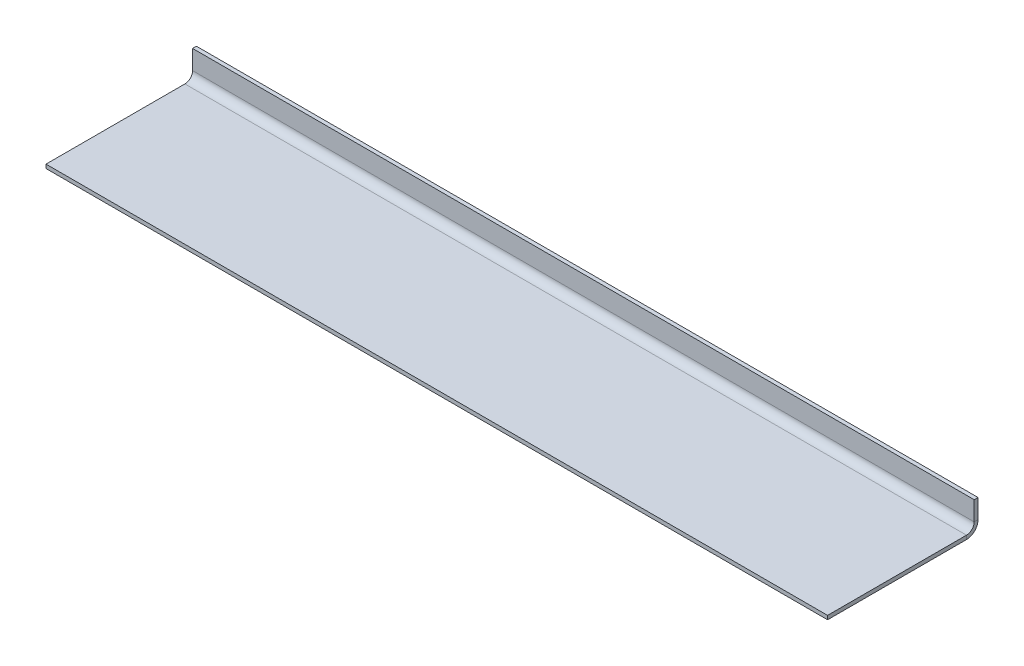
ISO-10303-21;
HEADER;
FILE_DESCRIPTION(('STEP AP214'),'2;1');
FILE_NAME('part.step','',(''),(''),'','','');
FILE_SCHEMA(('AUTOMOTIVE_DESIGN { 1 0 10303 214 1 1 1 1 }'));
ENDSEC;
DATA;
#1=APPLICATION_CONTEXT('core data for automotive mechanical design processes');
#2=APPLICATION_PROTOCOL_DEFINITION('international standard','automotive_design',2000,#1);
#3=PRODUCT_CONTEXT('',#1,'mechanical');
#4=PRODUCT('Part','Part','',(#3));
#5=PRODUCT_RELATED_PRODUCT_CATEGORY('part','',(#4));
#6=PRODUCT_DEFINITION_FORMATION('','',#4);
#7=PRODUCT_DEFINITION_CONTEXT('part definition',#1,'design');
#8=PRODUCT_DEFINITION('design','',#6,#7);
#9=PRODUCT_DEFINITION_SHAPE('','',#8);
#10=(LENGTH_UNIT() NAMED_UNIT(*) SI_UNIT(.MILLI.,.METRE.));
#11=(NAMED_UNIT(*) PLANE_ANGLE_UNIT() SI_UNIT($,.RADIAN.));
#12=(NAMED_UNIT(*) SI_UNIT($,.STERADIAN.) SOLID_ANGLE_UNIT());
#13=UNCERTAINTY_MEASURE_WITH_UNIT(LENGTH_MEASURE(1.E-05),#10,'distance_accuracy_value','');
#14=(GEOMETRIC_REPRESENTATION_CONTEXT(3) GLOBAL_UNCERTAINTY_ASSIGNED_CONTEXT((#13)) GLOBAL_UNIT_ASSIGNED_CONTEXT((#10,
#11,#12)) REPRESENTATION_CONTEXT('',''));
#15=CARTESIAN_POINT('',(0.,0.,0.));
#16=DIRECTION('',(0.,0.,1.));
#17=DIRECTION('',(1.,0.,0.));
#18=AXIS2_PLACEMENT_3D('',#15,#16,#17);
#19=CARTESIAN_POINT('',(0.,-3.175,0.));
#20=DIRECTION('',(-1.,0.,0.));
#21=DIRECTION('',(0.,0.,1.));
#22=AXIS2_PLACEMENT_3D('',#19,#20,#21);
#23=PLANE('',#22);
#24=DIRECTION('',(0.,0.,1.));
#25=VECTOR('',#24,1.);
#26=CARTESIAN_POINT('',(0.,0.,0.));
#27=LINE('',#26,#25);
#28=CARTESIAN_POINT('',(0.,0.,-114.72672));
#29=VERTEX_POINT('',#28);
#30=CARTESIAN_POINT('',(0.,0.,0.));
#31=VERTEX_POINT('',#30);
#32=EDGE_CURVE('E90',#29,#31,#27,.T.);
#33=ORIENTED_EDGE('',*,*,#32,.F.);
#34=DIRECTION('',(0.,-1.,0.));
#35=VECTOR('',#34,1.);
#36=CARTESIAN_POINT('',(0.,0.,-114.72672));
#37=LINE('',#36,#35);
#38=CARTESIAN_POINT('',(0.,-3.17500000000005,-114.72672));
#39=VERTEX_POINT('',#38);
#40=EDGE_CURVE('E99',#29,#39,#37,.T.);
#41=ORIENTED_EDGE('',*,*,#40,.T.);
#42=DIRECTION('',(0.,0.,1.));
#43=VECTOR('',#42,1.);
#44=CARTESIAN_POINT('',(0.,-3.175,0.));
#45=LINE('',#44,#43);
#46=CARTESIAN_POINT('',(0.,-3.175,0.));
#47=VERTEX_POINT('',#46);
#48=EDGE_CURVE('E86',#39,#47,#45,.T.);
#49=ORIENTED_EDGE('',*,*,#48,.T.);
#50=DIRECTION('',(0.,1.,0.));
#51=VECTOR('',#50,1.);
#52=CARTESIAN_POINT('',(0.,-3.175,0.));
#53=LINE('',#52,#51);
#54=EDGE_CURVE('E41',#47,#31,#53,.T.);
#55=ORIENTED_EDGE('',*,*,#54,.T.);
#56=EDGE_LOOP('',(#33,#41,#49,#55));
#57=FACE_BOUND('',#56,.T.);
#58=ADVANCED_FACE('F38',(#57),#23,.T.);
#59=CARTESIAN_POINT('',(0.,-3.175,0.));
#60=DIRECTION('',(0.,-1.,0.));
#61=DIRECTION('',(0.,0.,-1.));
#62=AXIS2_PLACEMENT_3D('',#59,#60,#61);
#63=PLANE('',#62);
#64=ORIENTED_EDGE('',*,*,#48,.F.);
#65=DIRECTION('',(-1.,0.,0.));
#66=VECTOR('',#65,1.);
#67=CARTESIAN_POINT('',(0.,-3.17500000000005,-114.72672));
#68=LINE('',#67,#66);
#69=CARTESIAN_POINT('',(645.65784,-3.175,-114.72672));
#70=VERTEX_POINT('',#69);
#71=EDGE_CURVE('E116',#39,#70,#68,.F.);
#72=ORIENTED_EDGE('',*,*,#71,.T.);
#73=DIRECTION('',(0.,0.,-1.));
#74=VECTOR('',#73,1.);
#75=CARTESIAN_POINT('',(645.65784,-3.175,0.));
#76=LINE('',#75,#74);
#77=CARTESIAN_POINT('',(645.65784,-3.175,0.));
#78=VERTEX_POINT('',#77);
#79=EDGE_CURVE('E95',#78,#70,#76,.T.);
#80=ORIENTED_EDGE('',*,*,#79,.F.);
#81=DIRECTION('',(1.,0.,0.));
#82=VECTOR('',#81,1.);
#83=CARTESIAN_POINT('',(0.,-3.175,0.));
#84=LINE('',#83,#82);
#85=EDGE_CURVE('E77',#47,#78,#84,.T.);
#86=ORIENTED_EDGE('',*,*,#85,.F.);
#87=EDGE_LOOP('',(#64,#72,#80,#86));
#88=FACE_BOUND('',#87,.T.);
#89=ADVANCED_FACE('F204',(#88),#63,.T.);
#90=CARTESIAN_POINT('',(0.,0.,0.));
#91=DIRECTION('',(0.,-1.,0.));
#92=DIRECTION('',(0.,0.,-1.));
#93=AXIS2_PLACEMENT_3D('',#90,#91,#92);
#94=PLANE('',#93);
#95=DIRECTION('',(-1.,0.,0.));
#96=VECTOR('',#95,1.);
#97=CARTESIAN_POINT('',(0.,0.,-114.72672));
#98=LINE('',#97,#96);
#99=CARTESIAN_POINT('',(645.65784,0.,-114.72672));
#100=VERTEX_POINT('',#99);
#101=EDGE_CURVE('E106',#29,#100,#98,.F.);
#102=ORIENTED_EDGE('',*,*,#101,.F.);
#103=ORIENTED_EDGE('',*,*,#32,.T.);
#104=DIRECTION('',(1.,0.,0.));
#105=VECTOR('',#104,1.);
#106=CARTESIAN_POINT('',(0.,0.,0.));
#107=LINE('',#106,#105);
#108=CARTESIAN_POINT('',(645.65784,0.,0.));
#109=VERTEX_POINT('',#108);
#110=EDGE_CURVE('E75',#31,#109,#107,.T.);
#111=ORIENTED_EDGE('',*,*,#110,.T.);
#112=DIRECTION('',(0.,0.,-1.));
#113=VECTOR('',#112,1.);
#114=CARTESIAN_POINT('',(645.65784,0.,0.));
#115=LINE('',#114,#113);
#116=EDGE_CURVE('E80',#109,#100,#115,.T.);
#117=ORIENTED_EDGE('',*,*,#116,.T.);
#118=EDGE_LOOP('',(#102,#103,#111,#117));
#119=FACE_BOUND('',#118,.T.);
#120=ADVANCED_FACE('F88',(#119),#94,.F.);
#121=CARTESIAN_POINT('',(645.65784,-3.175,0.));
#122=DIRECTION('',(1.,0.,0.));
#123=DIRECTION('',(0.,0.,-1.));
#124=AXIS2_PLACEMENT_3D('',#121,#122,#123);
#125=PLANE('',#124);
#126=DIRECTION('',(0.,-1.,0.));
#127=VECTOR('',#126,1.);
#128=CARTESIAN_POINT('',(645.65784,0.,-114.72672));
#129=LINE('',#128,#127);
#130=EDGE_CURVE('E83',#100,#70,#129,.T.);
#131=ORIENTED_EDGE('',*,*,#130,.F.);
#132=ORIENTED_EDGE('',*,*,#116,.F.);
#133=DIRECTION('',(0.,1.,0.));
#134=VECTOR('',#133,1.);
#135=CARTESIAN_POINT('',(645.65784,-3.175,0.));
#136=LINE('',#135,#134);
#137=EDGE_CURVE('E11',#78,#109,#136,.T.);
#138=ORIENTED_EDGE('',*,*,#137,.F.);
#139=ORIENTED_EDGE('',*,*,#79,.T.);
#140=EDGE_LOOP('',(#131,#132,#138,#139));
#141=FACE_BOUND('',#140,.T.);
#142=ADVANCED_FACE('F81',(#141),#125,.T.);
#143=CARTESIAN_POINT('',(0.,-3.175,0.));
#144=DIRECTION('',(0.,0.,1.));
#145=DIRECTION('',(1.,0.,0.));
#146=AXIS2_PLACEMENT_3D('',#143,#144,#145);
#147=PLANE('',#146);
#148=ORIENTED_EDGE('',*,*,#110,.F.);
#149=ORIENTED_EDGE('',*,*,#54,.F.);
#150=ORIENTED_EDGE('',*,*,#85,.T.);
#151=ORIENTED_EDGE('',*,*,#137,.T.);
#152=EDGE_LOOP('',(#148,#149,#150,#151));
#153=FACE_BOUND('',#152,.T.);
#154=ADVANCED_FACE('F72',(#153),#147,.T.);
#155=CARTESIAN_POINT('',(645.65784,6.34999999999994,-114.72672));
#156=DIRECTION('',(1.,0.,0.));
#157=DIRECTION('',(0.,0.,-1.));
#158=AXIS2_PLACEMENT_3D('',#155,#156,#157);
#159=PLANE('',#158);
#160=DIRECTION('',(0.,0.,-1.));
#161=VECTOR('',#160,1.);
#162=CARTESIAN_POINT('',(645.65784,6.34999999999998,-121.07672));
#163=LINE('',#162,#161);
#164=CARTESIAN_POINT('',(645.65784,6.34999999999992,-121.07672));
#165=VERTEX_POINT('',#164);
#166=CARTESIAN_POINT('',(645.65784,6.34999999999991,-124.25172));
#167=VERTEX_POINT('',#166);
#168=EDGE_CURVE('E146',#165,#167,#163,.T.);
#169=ORIENTED_EDGE('',*,*,#168,.F.);
#170=CARTESIAN_POINT('',(645.65784,6.34999999999994,-114.72672));
#171=DIRECTION('',(-1.,0.,0.));
#172=DIRECTION('',(0.,0.,1.));
#173=AXIS2_PLACEMENT_3D('',#170,#171,#172);
#174=CIRCLE('',#173,6.34999999999999);
#175=EDGE_CURVE('E110',#100,#165,#174,.F.);
#176=ORIENTED_EDGE('',*,*,#175,.F.);
#177=ORIENTED_EDGE('',*,*,#130,.T.);
#178=CARTESIAN_POINT('',(645.65784,6.34999999999994,-114.72672));
#179=DIRECTION('',(-1.,0.,0.));
#180=DIRECTION('',(0.,0.,1.));
#181=AXIS2_PLACEMENT_3D('',#178,#179,#180);
#182=CIRCLE('',#181,9.525);
#183=EDGE_CURVE('E52',#70,#167,#182,.F.);
#184=ORIENTED_EDGE('',*,*,#183,.T.);
#185=EDGE_LOOP('',(#169,#176,#177,#184));
#186=FACE_BOUND('',#185,.T.);
#187=ADVANCED_FACE('F201',(#186),#159,.T.);
#188=CARTESIAN_POINT('',(0.,6.34999999999994,-114.72672));
#189=DIRECTION('',(1.,0.,0.));
#190=DIRECTION('',(0.,0.,-1.));
#191=AXIS2_PLACEMENT_3D('',#188,#189,#190);
#192=PLANE('',#191);
#193=CARTESIAN_POINT('',(0.,6.34999999999994,-114.72672));
#194=DIRECTION('',(-1.,0.,0.));
#195=DIRECTION('',(0.,0.,1.));
#196=AXIS2_PLACEMENT_3D('',#193,#194,#195);
#197=CIRCLE('',#196,6.34999999999999);
#198=CARTESIAN_POINT('',(0.,6.34999999999992,-121.07672));
#199=VERTEX_POINT('',#198);
#200=EDGE_CURVE('E103',#199,#29,#197,.T.);
#201=ORIENTED_EDGE('',*,*,#200,.F.);
#202=DIRECTION('',(0.,0.,-1.));
#203=VECTOR('',#202,1.);
#204=CARTESIAN_POINT('',(0.,6.34999999999999,-121.07672));
#205=LINE('',#204,#203);
#206=CARTESIAN_POINT('',(0.,6.35000000000002,-124.25172));
#207=VERTEX_POINT('',#206);
#208=EDGE_CURVE('E145',#199,#207,#205,.T.);
#209=ORIENTED_EDGE('',*,*,#208,.T.);
#210=CARTESIAN_POINT('',(0.,6.34999999999994,-114.72672));
#211=DIRECTION('',(-1.,0.,0.));
#212=DIRECTION('',(0.,0.,1.));
#213=AXIS2_PLACEMENT_3D('',#210,#211,#212);
#214=CIRCLE('',#213,9.525);
#215=EDGE_CURVE('E113',#207,#39,#214,.T.);
#216=ORIENTED_EDGE('',*,*,#215,.T.);
#217=ORIENTED_EDGE('',*,*,#40,.F.);
#218=EDGE_LOOP('',(#201,#209,#216,#217));
#219=FACE_BOUND('',#218,.T.);
#220=ADVANCED_FACE('F167',(#219),#192,.F.);
#221=CARTESIAN_POINT('',(0.,6.34999999999994,-114.72672));
#222=DIRECTION('',(-1.,0.,0.));
#223=DIRECTION('',(0.,0.,-1.));
#224=AXIS2_PLACEMENT_3D('',#221,#222,#223);
#225=CYLINDRICAL_SURFACE('',#224,9.525);
#226=ORIENTED_EDGE('',*,*,#71,.F.);
#227=ORIENTED_EDGE('',*,*,#215,.F.);
#228=DIRECTION('',(1.,0.,0.));
#229=VECTOR('',#228,1.);
#230=CARTESIAN_POINT('',(0.,6.35000000000002,-124.25172));
#231=LINE('',#230,#229);
#232=EDGE_CURVE('E136',#207,#167,#231,.T.);
#233=ORIENTED_EDGE('',*,*,#232,.T.);
#234=ORIENTED_EDGE('',*,*,#183,.F.);
#235=EDGE_LOOP('',(#226,#227,#233,#234));
#236=FACE_BOUND('',#235,.T.);
#237=ADVANCED_FACE('F205',(#236),#225,.T.);
#238=CARTESIAN_POINT('',(0.,6.34999999999994,-114.72672));
#239=DIRECTION('',(-1.,0.,0.));
#240=DIRECTION('',(0.,0.,-1.));
#241=AXIS2_PLACEMENT_3D('',#238,#239,#240);
#242=CYLINDRICAL_SURFACE('',#241,6.34999999999999);
#243=ORIENTED_EDGE('',*,*,#101,.T.);
#244=ORIENTED_EDGE('',*,*,#175,.T.);
#245=DIRECTION('',(-1.,0.,0.));
#246=VECTOR('',#245,1.);
#247=CARTESIAN_POINT('',(645.65784,6.34999999999998,-121.07672));
#248=LINE('',#247,#246);
#249=EDGE_CURVE('E149',#165,#199,#248,.T.);
#250=ORIENTED_EDGE('',*,*,#249,.T.);
#251=ORIENTED_EDGE('',*,*,#200,.T.);
#252=EDGE_LOOP('',(#243,#244,#250,#251));
#253=FACE_BOUND('',#252,.T.);
#254=ADVANCED_FACE('F157',(#253),#242,.F.);
#255=CARTESIAN_POINT('',(0.,22.225,-124.25172));
#256=DIRECTION('',(1.,0.,0.));
#257=DIRECTION('',(0.,0.,-1.));
#258=AXIS2_PLACEMENT_3D('',#255,#256,#257);
#259=PLANE('',#258);
#260=ORIENTED_EDGE('',*,*,#208,.F.);
#261=DIRECTION('',(0.,1.,0.));
#262=VECTOR('',#261,1.);
#263=CARTESIAN_POINT('',(0.,22.225,-121.07672));
#264=LINE('',#263,#262);
#265=CARTESIAN_POINT('',(0.,22.225,-121.07672));
#266=VERTEX_POINT('',#265);
#267=EDGE_CURVE('E133',#199,#266,#264,.T.);
#268=ORIENTED_EDGE('',*,*,#267,.T.);
#269=DIRECTION('',(0.,0.,1.));
#270=VECTOR('',#269,1.);
#271=CARTESIAN_POINT('',(0.,22.225,-124.25172));
#272=LINE('',#271,#270);
#273=CARTESIAN_POINT('',(0.,22.225,-124.25172));
#274=VERTEX_POINT('',#273);
#275=EDGE_CURVE('E107',#274,#266,#272,.T.);
#276=ORIENTED_EDGE('',*,*,#275,.F.);
#277=DIRECTION('',(0.,1.,0.));
#278=VECTOR('',#277,1.);
#279=CARTESIAN_POINT('',(0.,22.225,-124.25172));
#280=LINE('',#279,#278);
#281=EDGE_CURVE('E129',#207,#274,#280,.T.);
#282=ORIENTED_EDGE('',*,*,#281,.F.);
#283=EDGE_LOOP('',(#260,#268,#276,#282));
#284=FACE_BOUND('',#283,.T.);
#285=ADVANCED_FACE('F172',(#284),#259,.F.);
#286=CARTESIAN_POINT('',(645.65784,0.,-124.25172));
#287=DIRECTION('',(-1.,0.,0.));
#288=DIRECTION('',(0.,0.,1.));
#289=AXIS2_PLACEMENT_3D('',#286,#287,#288);
#290=PLANE('',#289);
#291=ORIENTED_EDGE('',*,*,#168,.T.);
#292=DIRECTION('',(0.,-1.,0.));
#293=VECTOR('',#292,1.);
#294=CARTESIAN_POINT('',(645.65784,0.,-124.25172));
#295=LINE('',#294,#293);
#296=CARTESIAN_POINT('',(645.65784,22.225,-124.25172));
#297=VERTEX_POINT('',#296);
#298=EDGE_CURVE('E125',#297,#167,#295,.T.);
#299=ORIENTED_EDGE('',*,*,#298,.F.);
#300=DIRECTION('',(0.,0.,1.));
#301=VECTOR('',#300,1.);
#302=CARTESIAN_POINT('',(645.65784,22.225,-124.25172));
#303=LINE('',#302,#301);
#304=CARTESIAN_POINT('',(645.65784,22.225,-121.07672));
#305=VERTEX_POINT('',#304);
#306=EDGE_CURVE('E122',#297,#305,#303,.T.);
#307=ORIENTED_EDGE('',*,*,#306,.T.);
#308=DIRECTION('',(0.,-1.,0.));
#309=VECTOR('',#308,1.);
#310=CARTESIAN_POINT('',(645.65784,0.,-121.07672));
#311=LINE('',#310,#309);
#312=EDGE_CURVE('E126',#305,#165,#311,.T.);
#313=ORIENTED_EDGE('',*,*,#312,.T.);
#314=EDGE_LOOP('',(#291,#299,#307,#313));
#315=FACE_BOUND('',#314,.T.);
#316=ADVANCED_FACE('F188',(#315),#290,.F.);
#317=CARTESIAN_POINT('',(0.,-4.64703548717958E-13,-124.25172));
#318=DIRECTION('',(0.,0.,1.));
#319=DIRECTION('',(0.,-1.,0.));
#320=AXIS2_PLACEMENT_3D('',#317,#318,#319);
#321=PLANE('',#320);
#322=ORIENTED_EDGE('',*,*,#232,.F.);
#323=ORIENTED_EDGE('',*,*,#281,.T.);
#324=DIRECTION('',(1.,0.,0.));
#325=VECTOR('',#324,1.);
#326=CARTESIAN_POINT('',(645.65784,22.225,-124.25172));
#327=LINE('',#326,#325);
#328=EDGE_CURVE('E139',#274,#297,#327,.T.);
#329=ORIENTED_EDGE('',*,*,#328,.T.);
#330=ORIENTED_EDGE('',*,*,#298,.T.);
#331=EDGE_LOOP('',(#322,#323,#329,#330));
#332=FACE_BOUND('',#331,.T.);
#333=ADVANCED_FACE('F193',(#332),#321,.F.);
#334=CARTESIAN_POINT('',(0.,-4.53618095467131E-13,-121.07672));
#335=DIRECTION('',(0.,0.,1.));
#336=DIRECTION('',(0.,-1.,0.));
#337=AXIS2_PLACEMENT_3D('',#334,#335,#336);
#338=PLANE('',#337);
#339=ORIENTED_EDGE('',*,*,#267,.F.);
#340=ORIENTED_EDGE('',*,*,#249,.F.);
#341=ORIENTED_EDGE('',*,*,#312,.F.);
#342=DIRECTION('',(1.,0.,0.));
#343=VECTOR('',#342,1.);
#344=CARTESIAN_POINT('',(645.65784,22.225,-121.07672));
#345=LINE('',#344,#343);
#346=EDGE_CURVE('E130',#266,#305,#345,.T.);
#347=ORIENTED_EDGE('',*,*,#346,.F.);
#348=EDGE_LOOP('',(#339,#340,#341,#347));
#349=FACE_BOUND('',#348,.T.);
#350=ADVANCED_FACE('F176',(#349),#338,.T.);
#351=CARTESIAN_POINT('',(645.65784,22.225,-124.25172));
#352=DIRECTION('',(0.,-1.,0.));
#353=DIRECTION('',(0.,0.,-1.));
#354=AXIS2_PLACEMENT_3D('',#351,#352,#353);
#355=PLANE('',#354);
#356=ORIENTED_EDGE('',*,*,#346,.T.);
#357=ORIENTED_EDGE('',*,*,#306,.F.);
#358=ORIENTED_EDGE('',*,*,#328,.F.);
#359=ORIENTED_EDGE('',*,*,#275,.T.);
#360=EDGE_LOOP('',(#356,#357,#358,#359));
#361=FACE_BOUND('',#360,.T.);
#362=ADVANCED_FACE('F181',(#361),#355,.F.);
#363=CLOSED_SHELL('',(#58,#89,#120,#142,#154,#187,#220,#237,#254,#285,#316,#333,#350,#362));
#364=MANIFOLD_SOLID_BREP('B2',#363);
#365=ADVANCED_BREP_SHAPE_REPRESENTATION('',(#18,#364),#14);
#366=SHAPE_DEFINITION_REPRESENTATION(#9,#365);
ENDSEC;
END-ISO-10303-21;
